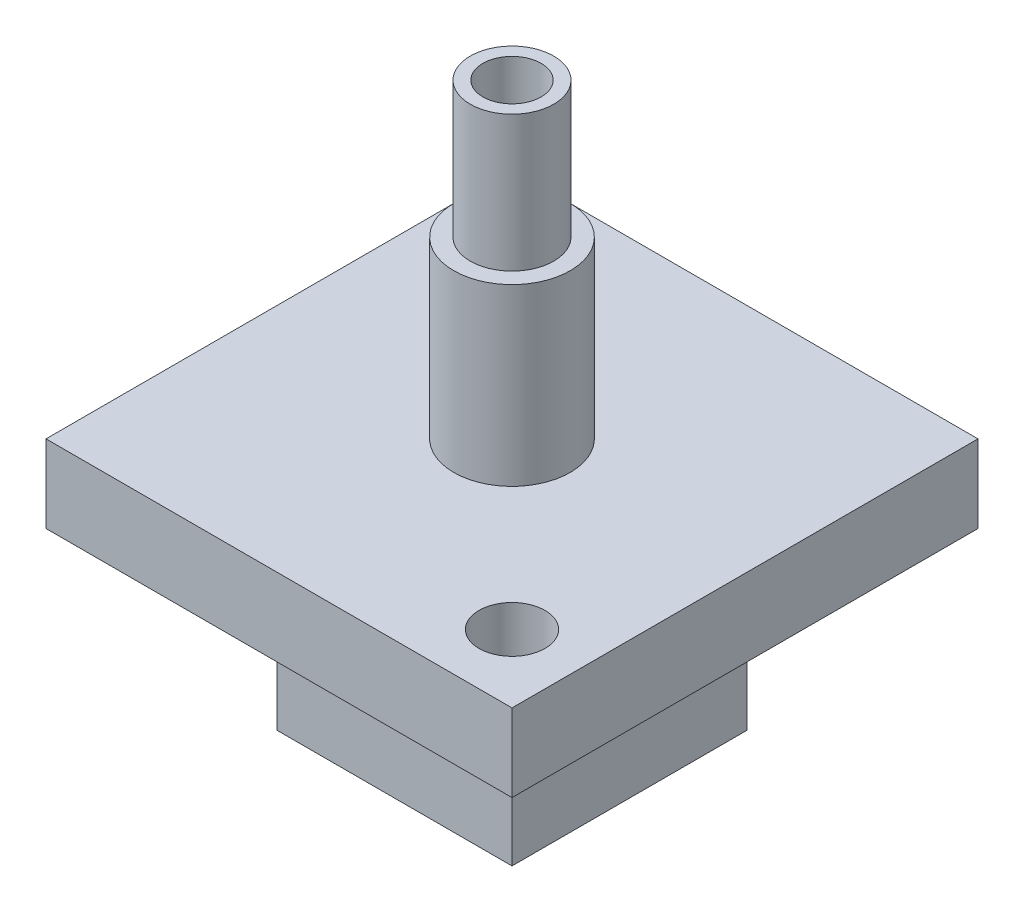
ISO-10303-21;
HEADER;
FILE_DESCRIPTION(('STEP AP214'),'2;1');
FILE_NAME('part.step','',(''),(''),'','','');
FILE_SCHEMA(('AUTOMOTIVE_DESIGN { 1 0 10303 214 1 1 1 1 }'));
ENDSEC;
DATA;
#1=APPLICATION_CONTEXT('core data for automotive mechanical design processes');
#2=APPLICATION_PROTOCOL_DEFINITION('international standard','automotive_design',2000,#1);
#3=PRODUCT_CONTEXT('',#1,'mechanical');
#4=PRODUCT('Part','Part','',(#3));
#5=PRODUCT_RELATED_PRODUCT_CATEGORY('part','',(#4));
#6=PRODUCT_DEFINITION_FORMATION('','',#4);
#7=PRODUCT_DEFINITION_CONTEXT('part definition',#1,'design');
#8=PRODUCT_DEFINITION('design','',#6,#7);
#9=PRODUCT_DEFINITION_SHAPE('','',#8);
#10=(LENGTH_UNIT() NAMED_UNIT(*) SI_UNIT(.MILLI.,.METRE.));
#11=(NAMED_UNIT(*) PLANE_ANGLE_UNIT() SI_UNIT($,.RADIAN.));
#12=(NAMED_UNIT(*) SI_UNIT($,.STERADIAN.) SOLID_ANGLE_UNIT());
#13=UNCERTAINTY_MEASURE_WITH_UNIT(LENGTH_MEASURE(1.E-05),#10,'distance_accuracy_value','');
#14=(GEOMETRIC_REPRESENTATION_CONTEXT(3) GLOBAL_UNCERTAINTY_ASSIGNED_CONTEXT((#13)) GLOBAL_UNIT_ASSIGNED_CONTEXT((#10,
#11,#12)) REPRESENTATION_CONTEXT('',''));
#15=CARTESIAN_POINT('',(0.,0.,0.));
#16=DIRECTION('',(0.,0.,1.));
#17=DIRECTION('',(1.,0.,0.));
#18=AXIS2_PLACEMENT_3D('',#15,#16,#17);
#19=CARTESIAN_POINT('',(7.95,114.,-6.05));
#20=DIRECTION('',(1.,0.,0.));
#21=DIRECTION('',(0.,0.,-1.));
#22=AXIS2_PLACEMENT_3D('',#19,#20,#21);
#23=PLANE('',#22);
#24=DIRECTION('',(0.,0.,1.));
#25=VECTOR('',#24,1.);
#26=CARTESIAN_POINT('',(7.95,105.,-6.05));
#27=LINE('',#26,#25);
#28=CARTESIAN_POINT('',(7.95,105.,-6.05));
#29=VERTEX_POINT('',#28);
#30=CARTESIAN_POINT('',(7.95,105.,6.05));
#31=VERTEX_POINT('',#30);
#32=EDGE_CURVE('E147',#29,#31,#27,.T.);
#33=ORIENTED_EDGE('',*,*,#32,.T.);
#34=DIRECTION('',(0.,-1.,0.));
#35=VECTOR('',#34,1.);
#36=CARTESIAN_POINT('',(7.95,114.,6.05));
#37=LINE('',#36,#35);
#38=CARTESIAN_POINT('',(7.95,114.,6.05));
#39=VERTEX_POINT('',#38);
#40=EDGE_CURVE('E188',#39,#31,#37,.T.);
#41=ORIENTED_EDGE('',*,*,#40,.F.);
#42=DIRECTION('',(0.,0.,1.));
#43=VECTOR('',#42,1.);
#44=CARTESIAN_POINT('',(7.95,114.,-6.05));
#45=LINE('',#44,#43);
#46=CARTESIAN_POINT('',(7.95,114.,-6.05));
#47=VERTEX_POINT('',#46);
#48=EDGE_CURVE('E161',#47,#39,#45,.T.);
#49=ORIENTED_EDGE('',*,*,#48,.F.);
#50=DIRECTION('',(0.,-1.,0.));
#51=VECTOR('',#50,1.);
#52=CARTESIAN_POINT('',(7.95,114.,-6.05));
#53=LINE('',#52,#51);
#54=EDGE_CURVE('E173',#47,#29,#53,.T.);
#55=ORIENTED_EDGE('',*,*,#54,.T.);
#56=EDGE_LOOP('',(#33,#41,#49,#55));
#57=FACE_BOUND('',#56,.T.);
#58=ADVANCED_FACE('F44',(#57),#23,.F.);
#59=CARTESIAN_POINT('',(7.95,114.,6.05));
#60=DIRECTION('',(0.,0.,-1.));
#61=DIRECTION('',(-1.,0.,0.));
#62=AXIS2_PLACEMENT_3D('',#59,#60,#61);
#63=PLANE('',#62);
#64=DIRECTION('',(1.,0.,0.));
#65=VECTOR('',#64,1.);
#66=CARTESIAN_POINT('',(7.95,105.,6.05));
#67=LINE('',#66,#65);
#68=CARTESIAN_POINT('',(20.05,105.,6.05));
#69=VERTEX_POINT('',#68);
#70=EDGE_CURVE('E154',#31,#69,#67,.T.);
#71=ORIENTED_EDGE('',*,*,#70,.T.);
#72=DIRECTION('',(0.,-1.,0.));
#73=VECTOR('',#72,1.);
#74=CARTESIAN_POINT('',(20.05,114.,6.05));
#75=LINE('',#74,#73);
#76=CARTESIAN_POINT('',(20.05,114.,6.05));
#77=VERTEX_POINT('',#76);
#78=EDGE_CURVE('E186',#77,#69,#75,.T.);
#79=ORIENTED_EDGE('',*,*,#78,.F.);
#80=DIRECTION('',(1.,0.,0.));
#81=VECTOR('',#80,1.);
#82=CARTESIAN_POINT('',(7.95,114.,6.05));
#83=LINE('',#82,#81);
#84=EDGE_CURVE('E93',#39,#77,#83,.T.);
#85=ORIENTED_EDGE('',*,*,#84,.F.);
#86=ORIENTED_EDGE('',*,*,#40,.T.);
#87=EDGE_LOOP('',(#71,#79,#85,#86));
#88=FACE_BOUND('',#87,.T.);
#89=ADVANCED_FACE('F264',(#88),#63,.F.);
#90=CARTESIAN_POINT('',(20.05,114.,6.05));
#91=DIRECTION('',(-1.,0.,0.));
#92=DIRECTION('',(0.,0.,1.));
#93=AXIS2_PLACEMENT_3D('',#90,#91,#92);
#94=PLANE('',#93);
#95=DIRECTION('',(0.,0.,-1.));
#96=VECTOR('',#95,1.);
#97=CARTESIAN_POINT('',(20.05,105.,6.05));
#98=LINE('',#97,#96);
#99=CARTESIAN_POINT('',(20.05,105.,-6.05));
#100=VERTEX_POINT('',#99);
#101=EDGE_CURVE('E80',#69,#100,#98,.T.);
#102=ORIENTED_EDGE('',*,*,#101,.T.);
#103=DIRECTION('',(0.,-1.,0.));
#104=VECTOR('',#103,1.);
#105=CARTESIAN_POINT('',(20.05,114.,-6.05));
#106=LINE('',#105,#104);
#107=CARTESIAN_POINT('',(20.05,114.,-6.05));
#108=VERTEX_POINT('',#107);
#109=EDGE_CURVE('E63',#108,#100,#106,.T.);
#110=ORIENTED_EDGE('',*,*,#109,.F.);
#111=DIRECTION('',(0.,0.,-1.));
#112=VECTOR('',#111,1.);
#113=CARTESIAN_POINT('',(20.05,114.,6.05));
#114=LINE('',#113,#112);
#115=EDGE_CURVE('E170',#77,#108,#114,.T.);
#116=ORIENTED_EDGE('',*,*,#115,.F.);
#117=ORIENTED_EDGE('',*,*,#78,.T.);
#118=EDGE_LOOP('',(#102,#110,#116,#117));
#119=FACE_BOUND('',#118,.T.);
#120=ADVANCED_FACE('F269',(#119),#94,.F.);
#121=CARTESIAN_POINT('',(20.05,114.,-6.05));
#122=DIRECTION('',(0.,0.,1.));
#123=DIRECTION('',(1.,0.,0.));
#124=AXIS2_PLACEMENT_3D('',#121,#122,#123);
#125=PLANE('',#124);
#126=DIRECTION('',(-1.,0.,0.));
#127=VECTOR('',#126,1.);
#128=CARTESIAN_POINT('',(20.05,105.,-6.05));
#129=LINE('',#128,#127);
#130=EDGE_CURVE('E85',#100,#29,#129,.T.);
#131=ORIENTED_EDGE('',*,*,#130,.T.);
#132=ORIENTED_EDGE('',*,*,#54,.F.);
#133=DIRECTION('',(-1.,0.,0.));
#134=VECTOR('',#133,1.);
#135=CARTESIAN_POINT('',(20.05,114.,-6.05));
#136=LINE('',#135,#134);
#137=EDGE_CURVE('E171',#108,#47,#136,.T.);
#138=ORIENTED_EDGE('',*,*,#137,.F.);
#139=ORIENTED_EDGE('',*,*,#109,.T.);
#140=EDGE_LOOP('',(#131,#132,#138,#139));
#141=FACE_BOUND('',#140,.T.);
#142=ADVANCED_FACE('F273',(#141),#125,.F.);
#143=CARTESIAN_POINT('',(0.,105.,0.));
#144=DIRECTION('',(0.,1.,0.));
#145=DIRECTION('',(0.,0.,1.));
#146=AXIS2_PLACEMENT_3D('',#143,#144,#145);
#147=PLANE('',#146);
#148=CARTESIAN_POINT('',(14.,105.,0.));
#149=DIRECTION('',(0.,1.,0.));
#150=DIRECTION('',(0.,0.,1.));
#151=AXIS2_PLACEMENT_3D('',#148,#149,#150);
#152=CIRCLE('',#151,1.5);
#153=CARTESIAN_POINT('',(14.,105.,1.5));
#154=VERTEX_POINT('',#153);
#155=EDGE_CURVE('E213',#154,#154,#152,.T.);
#156=ORIENTED_EDGE('',*,*,#155,.T.);
#157=EDGE_LOOP('',(#156));
#158=FACE_BOUND('',#157,.T.);
#159=ORIENTED_EDGE('',*,*,#32,.F.);
#160=ORIENTED_EDGE('',*,*,#130,.F.);
#161=ORIENTED_EDGE('',*,*,#101,.F.);
#162=ORIENTED_EDGE('',*,*,#70,.F.);
#163=EDGE_LOOP('',(#159,#160,#161,#162));
#164=FACE_BOUND('',#163,.T.);
#165=ADVANCED_FACE('F272',(#158,#164),#147,.F.);
#166=CARTESIAN_POINT('',(0.,114.,0.));
#167=DIRECTION('',(0.,1.,0.));
#168=DIRECTION('',(0.,0.,1.));
#169=AXIS2_PLACEMENT_3D('',#166,#167,#168);
#170=PLANE('',#169);
#171=CARTESIAN_POINT('',(5.5,114.,-8.5));
#172=DIRECTION('',(0.,1.,0.));
#173=DIRECTION('',(0.,0.,1.));
#174=AXIS2_PLACEMENT_3D('',#171,#172,#173);
#175=CIRCLE('',#174,1.7);
#176=CARTESIAN_POINT('',(5.5,114.,-6.8));
#177=VERTEX_POINT('',#176);
#178=EDGE_CURVE('E204',#177,#177,#175,.F.);
#179=ORIENTED_EDGE('',*,*,#178,.F.);
#180=EDGE_LOOP('',(#179));
#181=FACE_BOUND('',#180,.T.);
#182=CARTESIAN_POINT('',(22.5,114.,8.5));
#183=DIRECTION('',(0.,1.,0.));
#184=DIRECTION('',(0.,0.,1.));
#185=AXIS2_PLACEMENT_3D('',#182,#183,#184);
#186=CIRCLE('',#185,1.7);
#187=CARTESIAN_POINT('',(22.5,114.,10.2));
#188=VERTEX_POINT('',#187);
#189=EDGE_CURVE('E193',#188,#188,#186,.F.);
#190=ORIENTED_EDGE('',*,*,#189,.F.);
#191=EDGE_LOOP('',(#190));
#192=FACE_BOUND('',#191,.T.);
#193=DIRECTION('',(0.,0.,1.));
#194=VECTOR('',#193,1.);
#195=CARTESIAN_POINT('',(2.,114.,-12.));
#196=LINE('',#195,#194);
#197=CARTESIAN_POINT('',(2.,114.,-12.));
#198=VERTEX_POINT('',#197);
#199=CARTESIAN_POINT('',(2.,114.,12.));
#200=VERTEX_POINT('',#199);
#201=EDGE_CURVE('E146',#198,#200,#196,.T.);
#202=ORIENTED_EDGE('',*,*,#201,.F.);
#203=DIRECTION('',(-1.,0.,0.));
#204=VECTOR('',#203,1.);
#205=CARTESIAN_POINT('',(26.,114.,-12.));
#206=LINE('',#205,#204);
#207=CARTESIAN_POINT('',(26.,114.,-12.));
#208=VERTEX_POINT('',#207);
#209=EDGE_CURVE('E145',#208,#198,#206,.T.);
#210=ORIENTED_EDGE('',*,*,#209,.F.);
#211=DIRECTION('',(0.,0.,-1.));
#212=VECTOR('',#211,1.);
#213=CARTESIAN_POINT('',(26.,114.,12.));
#214=LINE('',#213,#212);
#215=CARTESIAN_POINT('',(26.,114.,12.));
#216=VERTEX_POINT('',#215);
#217=EDGE_CURVE('E236',#216,#208,#214,.T.);
#218=ORIENTED_EDGE('',*,*,#217,.F.);
#219=DIRECTION('',(1.,0.,0.));
#220=VECTOR('',#219,1.);
#221=CARTESIAN_POINT('',(2.,114.,12.));
#222=LINE('',#221,#220);
#223=EDGE_CURVE('E235',#200,#216,#222,.T.);
#224=ORIENTED_EDGE('',*,*,#223,.F.);
#225=EDGE_LOOP('',(#202,#210,#218,#224));
#226=FACE_BOUND('',#225,.T.);
#227=ORIENTED_EDGE('',*,*,#137,.T.);
#228=ORIENTED_EDGE('',*,*,#48,.T.);
#229=ORIENTED_EDGE('',*,*,#84,.T.);
#230=ORIENTED_EDGE('',*,*,#115,.T.);
#231=EDGE_LOOP('',(#227,#228,#229,#230));
#232=FACE_BOUND('',#231,.T.);
#233=ADVANCED_FACE('F251',(#181,#192,#226,#232),#170,.F.);
#234=CARTESIAN_POINT('',(2.,118.,-12.));
#235=DIRECTION('',(1.,0.,0.));
#236=DIRECTION('',(0.,0.,-1.));
#237=AXIS2_PLACEMENT_3D('',#234,#235,#236);
#238=PLANE('',#237);
#239=ORIENTED_EDGE('',*,*,#201,.T.);
#240=DIRECTION('',(0.,-1.,0.));
#241=VECTOR('',#240,1.);
#242=CARTESIAN_POINT('',(2.,118.,12.));
#243=LINE('',#242,#241);
#244=CARTESIAN_POINT('',(2.,118.,12.));
#245=VERTEX_POINT('',#244);
#246=EDGE_CURVE('E127',#245,#200,#243,.T.);
#247=ORIENTED_EDGE('',*,*,#246,.F.);
#248=DIRECTION('',(0.,0.,1.));
#249=VECTOR('',#248,1.);
#250=CARTESIAN_POINT('',(2.,118.,-12.));
#251=LINE('',#250,#249);
#252=CARTESIAN_POINT('',(2.,118.,-12.));
#253=VERTEX_POINT('',#252);
#254=EDGE_CURVE('E133',#253,#245,#251,.T.);
#255=ORIENTED_EDGE('',*,*,#254,.F.);
#256=DIRECTION('',(0.,-1.,0.));
#257=VECTOR('',#256,1.);
#258=CARTESIAN_POINT('',(2.,118.,-12.));
#259=LINE('',#258,#257);
#260=EDGE_CURVE('E232',#253,#198,#259,.T.);
#261=ORIENTED_EDGE('',*,*,#260,.T.);
#262=EDGE_LOOP('',(#239,#247,#255,#261));
#263=FACE_BOUND('',#262,.T.);
#264=ADVANCED_FACE('F148',(#263),#238,.F.);
#265=CARTESIAN_POINT('',(2.,118.,12.));
#266=DIRECTION('',(0.,0.,-1.));
#267=DIRECTION('',(-1.,0.,0.));
#268=AXIS2_PLACEMENT_3D('',#265,#266,#267);
#269=PLANE('',#268);
#270=ORIENTED_EDGE('',*,*,#223,.T.);
#271=DIRECTION('',(0.,-1.,0.));
#272=VECTOR('',#271,1.);
#273=CARTESIAN_POINT('',(26.,118.,12.));
#274=LINE('',#273,#272);
#275=CARTESIAN_POINT('',(26.,118.,12.));
#276=VERTEX_POINT('',#275);
#277=EDGE_CURVE('E129',#276,#216,#274,.T.);
#278=ORIENTED_EDGE('',*,*,#277,.F.);
#279=DIRECTION('',(1.,0.,0.));
#280=VECTOR('',#279,1.);
#281=CARTESIAN_POINT('',(2.,118.,12.));
#282=LINE('',#281,#280);
#283=EDGE_CURVE('E122',#245,#276,#282,.T.);
#284=ORIENTED_EDGE('',*,*,#283,.F.);
#285=ORIENTED_EDGE('',*,*,#246,.T.);
#286=EDGE_LOOP('',(#270,#278,#284,#285));
#287=FACE_BOUND('',#286,.T.);
#288=ADVANCED_FACE('F123',(#287),#269,.F.);
#289=CARTESIAN_POINT('',(26.,118.,12.));
#290=DIRECTION('',(-1.,0.,0.));
#291=DIRECTION('',(0.,0.,1.));
#292=AXIS2_PLACEMENT_3D('',#289,#290,#291);
#293=PLANE('',#292);
#294=ORIENTED_EDGE('',*,*,#217,.T.);
#295=DIRECTION('',(0.,-1.,0.));
#296=VECTOR('',#295,1.);
#297=CARTESIAN_POINT('',(26.,118.,-12.));
#298=LINE('',#297,#296);
#299=CARTESIAN_POINT('',(26.,118.,-12.));
#300=VERTEX_POINT('',#299);
#301=EDGE_CURVE('E160',#300,#208,#298,.T.);
#302=ORIENTED_EDGE('',*,*,#301,.F.);
#303=DIRECTION('',(0.,0.,-1.));
#304=VECTOR('',#303,1.);
#305=CARTESIAN_POINT('',(26.,118.,12.));
#306=LINE('',#305,#304);
#307=EDGE_CURVE('E134',#276,#300,#306,.T.);
#308=ORIENTED_EDGE('',*,*,#307,.F.);
#309=ORIENTED_EDGE('',*,*,#277,.T.);
#310=EDGE_LOOP('',(#294,#302,#308,#309));
#311=FACE_BOUND('',#310,.T.);
#312=ADVANCED_FACE('F254',(#311),#293,.F.);
#313=CARTESIAN_POINT('',(26.,118.,-12.));
#314=DIRECTION('',(0.,0.,1.));
#315=DIRECTION('',(1.,0.,0.));
#316=AXIS2_PLACEMENT_3D('',#313,#314,#315);
#317=PLANE('',#316);
#318=ORIENTED_EDGE('',*,*,#209,.T.);
#319=ORIENTED_EDGE('',*,*,#260,.F.);
#320=DIRECTION('',(-1.,0.,0.));
#321=VECTOR('',#320,1.);
#322=CARTESIAN_POINT('',(26.,118.,-12.));
#323=LINE('',#322,#321);
#324=EDGE_CURVE('E138',#300,#253,#323,.T.);
#325=ORIENTED_EDGE('',*,*,#324,.F.);
#326=ORIENTED_EDGE('',*,*,#301,.T.);
#327=EDGE_LOOP('',(#318,#319,#325,#326));
#328=FACE_BOUND('',#327,.T.);
#329=ADVANCED_FACE('F248',(#328),#317,.F.);
#330=CARTESIAN_POINT('',(0.,118.,0.));
#331=DIRECTION('',(0.,1.,0.));
#332=DIRECTION('',(0.,0.,1.));
#333=AXIS2_PLACEMENT_3D('',#330,#331,#332);
#334=PLANE('',#333);
#335=CARTESIAN_POINT('',(5.5,118.,-8.5));
#336=DIRECTION('',(0.,1.,0.));
#337=DIRECTION('',(0.,0.,1.));
#338=AXIS2_PLACEMENT_3D('',#335,#336,#337);
#339=CIRCLE('',#338,1.7);
#340=CARTESIAN_POINT('',(5.5,118.,-6.8));
#341=VERTEX_POINT('',#340);
#342=EDGE_CURVE('E48',#341,#341,#339,.F.);
#343=ORIENTED_EDGE('',*,*,#342,.T.);
#344=EDGE_LOOP('',(#343));
#345=FACE_BOUND('',#344,.T.);
#346=CARTESIAN_POINT('',(22.5,118.,8.5));
#347=DIRECTION('',(0.,1.,0.));
#348=DIRECTION('',(0.,0.,1.));
#349=AXIS2_PLACEMENT_3D('',#346,#347,#348);
#350=CIRCLE('',#349,1.7);
#351=CARTESIAN_POINT('',(22.5,118.,10.2));
#352=VERTEX_POINT('',#351);
#353=EDGE_CURVE('E191',#352,#352,#350,.F.);
#354=ORIENTED_EDGE('',*,*,#353,.T.);
#355=EDGE_LOOP('',(#354));
#356=FACE_BOUND('',#355,.T.);
#357=CARTESIAN_POINT('',(14.,118.,0.));
#358=DIRECTION('',(0.,1.,0.));
#359=DIRECTION('',(0.,0.,1.));
#360=AXIS2_PLACEMENT_3D('',#357,#358,#359);
#361=CIRCLE('',#360,3.);
#362=CARTESIAN_POINT('',(14.,118.,3.));
#363=VERTEX_POINT('',#362);
#364=EDGE_CURVE('E54',#363,#363,#361,.T.);
#365=ORIENTED_EDGE('',*,*,#364,.F.);
#366=EDGE_LOOP('',(#365));
#367=FACE_BOUND('',#366,.T.);
#368=ORIENTED_EDGE('',*,*,#254,.T.);
#369=ORIENTED_EDGE('',*,*,#283,.T.);
#370=ORIENTED_EDGE('',*,*,#307,.T.);
#371=ORIENTED_EDGE('',*,*,#324,.T.);
#372=EDGE_LOOP('',(#368,#369,#370,#371));
#373=FACE_BOUND('',#372,.T.);
#374=ADVANCED_FACE('F137',(#345,#356,#367,#373),#334,.T.);
#375=CARTESIAN_POINT('',(14.,127.,0.));
#376=DIRECTION('',(0.,-1.,0.));
#377=DIRECTION('',(0.,0.,-1.));
#378=AXIS2_PLACEMENT_3D('',#375,#376,#377);
#379=CYLINDRICAL_SURFACE('',#378,3.);
#380=CARTESIAN_POINT('',(14.,127.,0.));
#381=DIRECTION('',(0.,1.,0.));
#382=DIRECTION('',(0.,0.,1.));
#383=AXIS2_PLACEMENT_3D('',#380,#381,#382);
#384=CIRCLE('',#383,3.);
#385=CARTESIAN_POINT('',(14.,127.,3.));
#386=VERTEX_POINT('',#385);
#387=EDGE_CURVE('E219',#386,#386,#384,.T.);
#388=ORIENTED_EDGE('',*,*,#387,.F.);
#389=EDGE_LOOP('',(#388));
#390=FACE_BOUND('',#389,.T.);
#391=ORIENTED_EDGE('',*,*,#364,.T.);
#392=EDGE_LOOP('',(#391));
#393=FACE_BOUND('',#392,.T.);
#394=ADVANCED_FACE('F298',(#390,#393),#379,.T.);
#395=CARTESIAN_POINT('',(14.,127.,0.));
#396=DIRECTION('',(0.,1.,0.));
#397=DIRECTION('',(0.,0.,1.));
#398=AXIS2_PLACEMENT_3D('',#395,#396,#397);
#399=PLANE('',#398);
#400=CARTESIAN_POINT('',(14.,127.,0.));
#401=DIRECTION('',(0.,1.,0.));
#402=DIRECTION('',(0.,0.,1.));
#403=AXIS2_PLACEMENT_3D('',#400,#401,#402);
#404=CIRCLE('',#403,2.15);
#405=CARTESIAN_POINT('',(14.,127.,2.15));
#406=VERTEX_POINT('',#405);
#407=EDGE_CURVE('E11',#406,#406,#404,.T.);
#408=ORIENTED_EDGE('',*,*,#407,.F.);
#409=EDGE_LOOP('',(#408));
#410=FACE_BOUND('',#409,.T.);
#411=ORIENTED_EDGE('',*,*,#387,.T.);
#412=EDGE_LOOP('',(#411));
#413=FACE_BOUND('',#412,.T.);
#414=ADVANCED_FACE('F304',(#410,#413),#399,.T.);
#415=CARTESIAN_POINT('',(14.,134.,0.));
#416=DIRECTION('',(0.,-1.,0.));
#417=DIRECTION('',(0.,0.,-1.));
#418=AXIS2_PLACEMENT_3D('',#415,#416,#417);
#419=CYLINDRICAL_SURFACE('',#418,2.15);
#420=CARTESIAN_POINT('',(14.,134.,0.));
#421=DIRECTION('',(0.,1.,0.));
#422=DIRECTION('',(0.,0.,1.));
#423=AXIS2_PLACEMENT_3D('',#420,#421,#422);
#424=CIRCLE('',#423,2.15);
#425=CARTESIAN_POINT('',(14.,134.,2.15));
#426=VERTEX_POINT('',#425);
#427=EDGE_CURVE('E220',#426,#426,#424,.T.);
#428=ORIENTED_EDGE('',*,*,#427,.F.);
#429=EDGE_LOOP('',(#428));
#430=FACE_BOUND('',#429,.T.);
#431=ORIENTED_EDGE('',*,*,#407,.T.);
#432=EDGE_LOOP('',(#431));
#433=FACE_BOUND('',#432,.T.);
#434=ADVANCED_FACE('F307',(#430,#433),#419,.T.);
#435=CARTESIAN_POINT('',(14.,134.,0.));
#436=DIRECTION('',(0.,1.,0.));
#437=DIRECTION('',(0.,0.,1.));
#438=AXIS2_PLACEMENT_3D('',#435,#436,#437);
#439=PLANE('',#438);
#440=CARTESIAN_POINT('',(14.,134.,0.));
#441=DIRECTION('',(0.,1.,0.));
#442=DIRECTION('',(0.,0.,1.));
#443=AXIS2_PLACEMENT_3D('',#440,#441,#442);
#444=CIRCLE('',#443,1.5);
#445=CARTESIAN_POINT('',(14.,134.,1.5));
#446=VERTEX_POINT('',#445);
#447=EDGE_CURVE('E207',#446,#446,#444,.T.);
#448=ORIENTED_EDGE('',*,*,#447,.F.);
#449=EDGE_LOOP('',(#448));
#450=FACE_BOUND('',#449,.T.);
#451=ORIENTED_EDGE('',*,*,#427,.T.);
#452=EDGE_LOOP('',(#451));
#453=FACE_BOUND('',#452,.T.);
#454=ADVANCED_FACE('F313',(#450,#453),#439,.T.);
#455=CARTESIAN_POINT('',(14.,104.8,0.));
#456=DIRECTION('',(0.,1.,0.));
#457=DIRECTION('',(0.,0.,1.));
#458=AXIS2_PLACEMENT_3D('',#455,#456,#457);
#459=CYLINDRICAL_SURFACE('',#458,1.5);
#460=ORIENTED_EDGE('',*,*,#447,.T.);
#461=EDGE_LOOP('',(#460));
#462=FACE_BOUND('',#461,.T.);
#463=ORIENTED_EDGE('',*,*,#155,.F.);
#464=EDGE_LOOP('',(#463));
#465=FACE_BOUND('',#464,.T.);
#466=ADVANCED_FACE('F312',(#462,#465),#459,.F.);
#467=CARTESIAN_POINT('',(22.5,118.2,8.5));
#468=DIRECTION('',(0.,-1.,0.));
#469=DIRECTION('',(0.,0.,-1.));
#470=AXIS2_PLACEMENT_3D('',#467,#468,#469);
#471=CYLINDRICAL_SURFACE('',#470,1.7);
#472=ORIENTED_EDGE('',*,*,#353,.F.);
#473=EDGE_LOOP('',(#472));
#474=FACE_BOUND('',#473,.T.);
#475=ORIENTED_EDGE('',*,*,#189,.T.);
#476=EDGE_LOOP('',(#475));
#477=FACE_BOUND('',#476,.T.);
#478=ADVANCED_FACE('F318',(#474,#477),#471,.F.);
#479=CARTESIAN_POINT('',(5.5,118.2,-8.5));
#480=DIRECTION('',(0.,-1.,0.));
#481=DIRECTION('',(0.,0.,-1.));
#482=AXIS2_PLACEMENT_3D('',#479,#480,#481);
#483=CYLINDRICAL_SURFACE('',#482,1.7);
#484=ORIENTED_EDGE('',*,*,#342,.F.);
#485=EDGE_LOOP('',(#484));
#486=FACE_BOUND('',#485,.T.);
#487=ORIENTED_EDGE('',*,*,#178,.T.);
#488=EDGE_LOOP('',(#487));
#489=FACE_BOUND('',#488,.T.);
#490=ADVANCED_FACE('F325',(#486,#489),#483,.F.);
#491=CLOSED_SHELL('',(#58,#89,#120,#142,#165,#233,#264,#288,#312,#329,#374,#394,#414,#434,#454,
#466,#478,#490));
#492=MANIFOLD_SOLID_BREP('B2',#491);
#493=ADVANCED_BREP_SHAPE_REPRESENTATION('',(#18,#492),#14);
#494=SHAPE_DEFINITION_REPRESENTATION(#9,#493);
ENDSEC;
END-ISO-10303-21;
